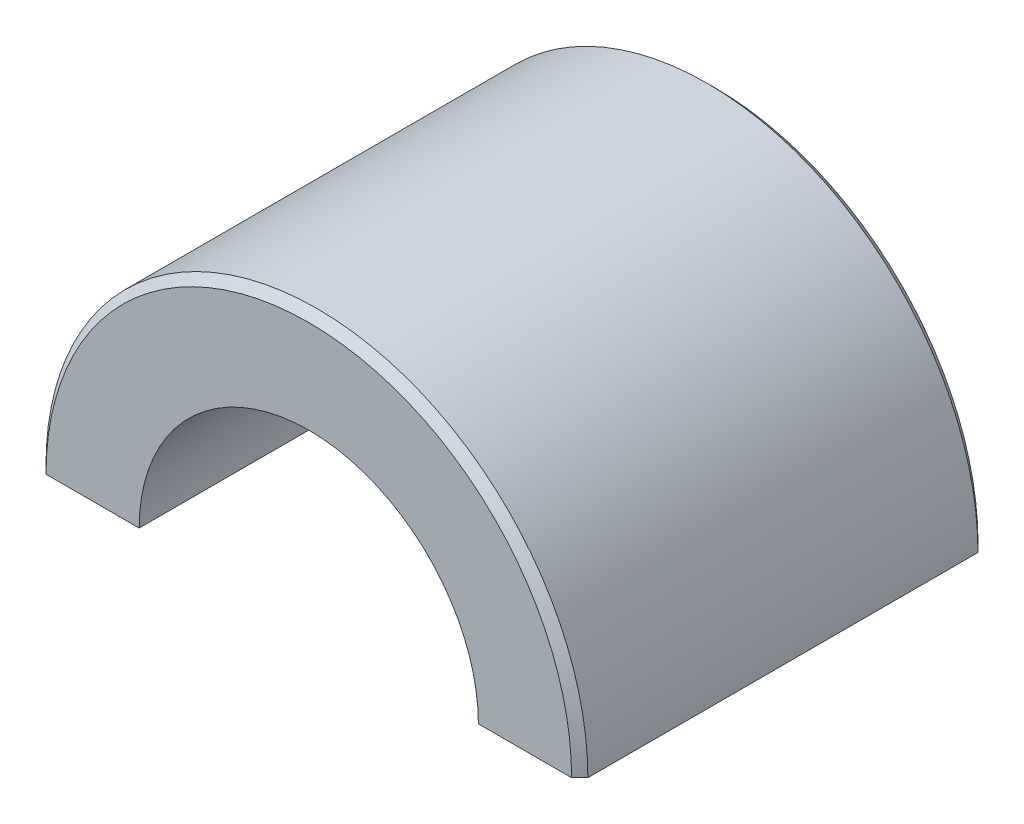
ISO-10303-21;
HEADER;
FILE_DESCRIPTION(('STEP AP214'),'2;1');
FILE_NAME('part.step','',(''),(''),'','','');
FILE_SCHEMA(('AUTOMOTIVE_DESIGN { 1 0 10303 214 1 1 1 1 }'));
ENDSEC;
DATA;
#1=APPLICATION_CONTEXT('core data for automotive mechanical design processes');
#2=APPLICATION_PROTOCOL_DEFINITION('international standard','automotive_design',2000,#1);
#3=PRODUCT_CONTEXT('',#1,'mechanical');
#4=PRODUCT('Part','Part','',(#3));
#5=PRODUCT_RELATED_PRODUCT_CATEGORY('part','',(#4));
#6=PRODUCT_DEFINITION_FORMATION('','',#4);
#7=PRODUCT_DEFINITION_CONTEXT('part definition',#1,'design');
#8=PRODUCT_DEFINITION('design','',#6,#7);
#9=PRODUCT_DEFINITION_SHAPE('','',#8);
#10=(LENGTH_UNIT() NAMED_UNIT(*) SI_UNIT(.MILLI.,.METRE.));
#11=(NAMED_UNIT(*) PLANE_ANGLE_UNIT() SI_UNIT($,.RADIAN.));
#12=(NAMED_UNIT(*) SI_UNIT($,.STERADIAN.) SOLID_ANGLE_UNIT());
#13=UNCERTAINTY_MEASURE_WITH_UNIT(LENGTH_MEASURE(1.E-05),#10,'distance_accuracy_value','');
#14=(GEOMETRIC_REPRESENTATION_CONTEXT(3) GLOBAL_UNCERTAINTY_ASSIGNED_CONTEXT((#13)) GLOBAL_UNIT_ASSIGNED_CONTEXT((#10,
#11,#12)) REPRESENTATION_CONTEXT('',''));
#15=CARTESIAN_POINT('',(0.,0.,0.));
#16=DIRECTION('',(0.,0.,1.));
#17=DIRECTION('',(1.,0.,0.));
#18=AXIS2_PLACEMENT_3D('',#15,#16,#17);
#19=CARTESIAN_POINT('',(0.,1.26634813746307E-13,19.05));
#20=DIRECTION('',(0.,0.,-1.));
#21=DIRECTION('',(-1.,0.,0.));
#22=AXIS2_PLACEMENT_3D('',#19,#20,#21);
#23=CYLINDRICAL_SURFACE('',#22,7.9502);
#24=CARTESIAN_POINT('',(0.,0.,0.));
#25=DIRECTION('',(0.,0.,-1.));
#26=DIRECTION('',(1.,0.,0.));
#27=AXIS2_PLACEMENT_3D('',#24,#25,#26);
#28=CIRCLE('',#27,7.9502);
#29=CARTESIAN_POINT('',(-7.95020000000002,1.23165366794353E-13,0.));
#30=VERTEX_POINT('',#29);
#31=CARTESIAN_POINT('',(7.95019999999999,0.,0.));
#32=VERTEX_POINT('',#31);
#33=EDGE_CURVE('E109',#30,#32,#28,.T.);
#34=ORIENTED_EDGE('',*,*,#33,.T.);
#35=DIRECTION('',(0.,0.,-1.));
#36=VECTOR('',#35,1.);
#37=CARTESIAN_POINT('',(7.9502,1.21430643318376E-13,19.05));
#38=LINE('',#37,#36);
#39=CARTESIAN_POINT('',(7.9502,1.21430643318376E-13,19.05));
#40=VERTEX_POINT('',#39);
#41=EDGE_CURVE('E93',#40,#32,#38,.T.);
#42=ORIENTED_EDGE('',*,*,#41,.F.);
#43=CARTESIAN_POINT('',(0.,1.26634813746307E-13,19.05));
#44=DIRECTION('',(0.,0.,-1.));
#45=DIRECTION('',(1.,0.,0.));
#46=AXIS2_PLACEMENT_3D('',#43,#44,#45);
#47=CIRCLE('',#46,7.9502);
#48=CARTESIAN_POINT('',(-7.95020000000003,0.,19.05));
#49=VERTEX_POINT('',#48);
#50=EDGE_CURVE('E98',#49,#40,#47,.T.);
#51=ORIENTED_EDGE('',*,*,#50,.F.);
#52=DIRECTION('',(0.,0.,-1.));
#53=VECTOR('',#52,1.);
#54=CARTESIAN_POINT('',(-7.95020000000003,0.,19.05));
#55=LINE('',#54,#53);
#56=EDGE_CURVE('E144',#49,#30,#55,.T.);
#57=ORIENTED_EDGE('',*,*,#56,.T.);
#58=EDGE_LOOP('',(#34,#42,#51,#57));
#59=FACE_BOUND('',#58,.T.);
#60=ADVANCED_FACE('F36',(#59),#23,.F.);
#61=CARTESIAN_POINT('',(7.9502,1.21430643318376E-13,19.05));
#62=DIRECTION('',(0.,1.,0.));
#63=DIRECTION('',(-1.,0.,0.));
#64=AXIS2_PLACEMENT_3D('',#61,#62,#63);
#65=PLANE('',#64);
#66=DIRECTION('',(1.,0.,0.));
#67=VECTOR('',#66,1.);
#68=CARTESIAN_POINT('',(7.95019999999999,0.,0.));
#69=LINE('',#68,#67);
#70=CARTESIAN_POINT('',(12.319,0.,0.));
#71=VERTEX_POINT('',#70);
#72=EDGE_CURVE('E128',#32,#71,#69,.T.);
#73=ORIENTED_EDGE('',*,*,#72,.T.);
#74=DIRECTION('',(-0.707106781186548,0.,-0.707106781186548));
#75=VECTOR('',#74,1.);
#76=CARTESIAN_POINT('',(0.,0.,-12.319));
#77=LINE('',#76,#75);
#78=CARTESIAN_POINT('',(12.7,0.,0.381000000000013));
#79=VERTEX_POINT('',#78);
#80=EDGE_CURVE('E44',#71,#79,#77,.F.);
#81=ORIENTED_EDGE('',*,*,#80,.T.);
#82=DIRECTION('',(0.,0.,-1.));
#83=VECTOR('',#82,1.);
#84=CARTESIAN_POINT('',(12.7,1.2490009027033E-13,19.05));
#85=LINE('',#84,#83);
#86=CARTESIAN_POINT('',(12.7,1.2490009027033E-13,18.669));
#87=VERTEX_POINT('',#86);
#88=EDGE_CURVE('E111',#87,#79,#85,.T.);
#89=ORIENTED_EDGE('',*,*,#88,.F.);
#90=DIRECTION('',(0.707106781186547,0.,-0.707106781186549));
#91=VECTOR('',#90,1.);
#92=CARTESIAN_POINT('',(0.,0.,31.3690000000001));
#93=LINE('',#92,#91);
#94=CARTESIAN_POINT('',(12.319,0.,19.05));
#95=VERTEX_POINT('',#94);
#96=EDGE_CURVE('E51',#87,#95,#93,.F.);
#97=ORIENTED_EDGE('',*,*,#96,.T.);
#98=DIRECTION('',(1.,0.,0.));
#99=VECTOR('',#98,1.);
#100=CARTESIAN_POINT('',(7.9502,1.21430643318376E-13,19.05));
#101=LINE('',#100,#99);
#102=EDGE_CURVE('E89',#40,#95,#101,.T.);
#103=ORIENTED_EDGE('',*,*,#102,.F.);
#104=ORIENTED_EDGE('',*,*,#41,.T.);
#105=EDGE_LOOP('',(#73,#81,#89,#97,#103,#104));
#106=FACE_BOUND('',#105,.T.);
#107=ADVANCED_FACE('F91',(#106),#65,.F.);
#108=CARTESIAN_POINT('',(0.,1.26634813746307E-13,19.05));
#109=DIRECTION('',(0.,0.,-1.));
#110=DIRECTION('',(-1.,0.,0.));
#111=AXIS2_PLACEMENT_3D('',#108,#109,#110);
#112=CYLINDRICAL_SURFACE('',#111,12.7);
#113=ORIENTED_EDGE('',*,*,#88,.T.);
#114=CARTESIAN_POINT('',(0.,0.,0.381000000000006));
#115=DIRECTION('',(0.,0.,1.));
#116=DIRECTION('',(1.,0.,0.));
#117=AXIS2_PLACEMENT_3D('',#114,#115,#116);
#118=CIRCLE('',#117,12.7);
#119=CARTESIAN_POINT('',(-12.7000000000001,0.,0.381000000000027));
#120=VERTEX_POINT('',#119);
#121=EDGE_CURVE('E113',#79,#120,#118,.T.);
#122=ORIENTED_EDGE('',*,*,#121,.T.);
#123=DIRECTION('',(0.,0.,-1.));
#124=VECTOR('',#123,1.);
#125=CARTESIAN_POINT('',(-12.7000000000001,0.,19.05));
#126=LINE('',#125,#124);
#127=CARTESIAN_POINT('',(-12.7000000000001,0.,18.669));
#128=VERTEX_POINT('',#127);
#129=EDGE_CURVE('E116',#128,#120,#126,.T.);
#130=ORIENTED_EDGE('',*,*,#129,.F.);
#131=CARTESIAN_POINT('',(0.,1.26634813746307E-13,18.669));
#132=DIRECTION('',(0.,0.,1.));
#133=DIRECTION('',(1.,0.,0.));
#134=AXIS2_PLACEMENT_3D('',#131,#132,#133);
#135=CIRCLE('',#134,12.7);
#136=EDGE_CURVE('E110',#128,#87,#135,.F.);
#137=ORIENTED_EDGE('',*,*,#136,.T.);
#138=EDGE_LOOP('',(#113,#122,#130,#137));
#139=FACE_BOUND('',#138,.T.);
#140=ADVANCED_FACE('F132',(#139),#112,.T.);
#141=CARTESIAN_POINT('',(-7.95020000000003,0.,19.05));
#142=DIRECTION('',(0.,1.,0.));
#143=DIRECTION('',(-1.,0.,0.));
#144=AXIS2_PLACEMENT_3D('',#141,#142,#143);
#145=PLANE('',#144);
#146=ORIENTED_EDGE('',*,*,#129,.T.);
#147=DIRECTION('',(-0.707106781186549,0.,0.707106781186548));
#148=VECTOR('',#147,1.);
#149=CARTESIAN_POINT('',(0.,0.,-12.319));
#150=LINE('',#149,#148);
#151=CARTESIAN_POINT('',(-12.319,0.,0.));
#152=VERTEX_POINT('',#151);
#153=EDGE_CURVE('E124',#120,#152,#150,.F.);
#154=ORIENTED_EDGE('',*,*,#153,.T.);
#155=DIRECTION('',(1.,0.,0.));
#156=VECTOR('',#155,1.);
#157=CARTESIAN_POINT('',(-7.95020000000002,1.23165366794353E-13,0.));
#158=LINE('',#157,#156);
#159=EDGE_CURVE('E106',#152,#30,#158,.T.);
#160=ORIENTED_EDGE('',*,*,#159,.T.);
#161=ORIENTED_EDGE('',*,*,#56,.F.);
#162=DIRECTION('',(1.,0.,0.));
#163=VECTOR('',#162,1.);
#164=CARTESIAN_POINT('',(-7.95020000000003,0.,19.05));
#165=LINE('',#164,#163);
#166=CARTESIAN_POINT('',(-12.3190000000001,0.,19.05));
#167=VERTEX_POINT('',#166);
#168=EDGE_CURVE('E97',#167,#49,#165,.T.);
#169=ORIENTED_EDGE('',*,*,#168,.F.);
#170=DIRECTION('',(0.707106781186547,0.,0.707106781186549));
#171=VECTOR('',#170,1.);
#172=CARTESIAN_POINT('',(0.,0.,31.3690000000001));
#173=LINE('',#172,#171);
#174=EDGE_CURVE('E122',#167,#128,#173,.F.);
#175=ORIENTED_EDGE('',*,*,#174,.T.);
#176=EDGE_LOOP('',(#146,#154,#160,#161,#169,#175));
#177=FACE_BOUND('',#176,.T.);
#178=ADVANCED_FACE('F138',(#177),#145,.F.);
#179=CARTESIAN_POINT('',(0.,1.26634813746307E-13,19.05));
#180=DIRECTION('',(0.,0.,1.));
#181=DIRECTION('',(1.,0.,0.));
#182=AXIS2_PLACEMENT_3D('',#179,#180,#181);
#183=PLANE('',#182);
#184=ORIENTED_EDGE('',*,*,#102,.T.);
#185=CARTESIAN_POINT('',(0.,1.26634813746307E-13,19.05));
#186=DIRECTION('',(0.,0.,1.));
#187=DIRECTION('',(1.,0.,0.));
#188=AXIS2_PLACEMENT_3D('',#185,#186,#187);
#189=CIRCLE('',#188,12.319);
#190=EDGE_CURVE('E11',#95,#167,#189,.T.);
#191=ORIENTED_EDGE('',*,*,#190,.T.);
#192=ORIENTED_EDGE('',*,*,#168,.T.);
#193=ORIENTED_EDGE('',*,*,#50,.T.);
#194=EDGE_LOOP('',(#184,#191,#192,#193));
#195=FACE_BOUND('',#194,.T.);
#196=ADVANCED_FACE('F101',(#195),#183,.T.);
#197=CARTESIAN_POINT('',(0.,0.,0.));
#198=DIRECTION('',(0.,0.,1.));
#199=DIRECTION('',(1.,0.,0.));
#200=AXIS2_PLACEMENT_3D('',#197,#198,#199);
#201=PLANE('',#200);
#202=ORIENTED_EDGE('',*,*,#159,.F.);
#203=CARTESIAN_POINT('',(0.,0.,0.));
#204=DIRECTION('',(0.,0.,1.));
#205=DIRECTION('',(1.,0.,0.));
#206=AXIS2_PLACEMENT_3D('',#203,#204,#205);
#207=CIRCLE('',#206,12.319);
#208=EDGE_CURVE('E59',#152,#71,#207,.F.);
#209=ORIENTED_EDGE('',*,*,#208,.T.);
#210=ORIENTED_EDGE('',*,*,#72,.F.);
#211=ORIENTED_EDGE('',*,*,#33,.F.);
#212=EDGE_LOOP('',(#202,#209,#210,#211));
#213=FACE_BOUND('',#212,.T.);
#214=ADVANCED_FACE('F139',(#213),#201,.F.);
#215=CARTESIAN_POINT('',(0.,0.,0.381000000000006));
#216=DIRECTION('',(0.,0.,1.));
#217=DIRECTION('',(1.,0.,0.));
#218=AXIS2_PLACEMENT_3D('',#215,#216,#217);
#219=CONICAL_SURFACE('',#218,12.7,0.785398163397448);
#220=ORIENTED_EDGE('',*,*,#80,.F.);
#221=ORIENTED_EDGE('',*,*,#208,.F.);
#222=ORIENTED_EDGE('',*,*,#153,.F.);
#223=ORIENTED_EDGE('',*,*,#121,.F.);
#224=EDGE_LOOP('',(#220,#221,#222,#223));
#225=FACE_BOUND('',#224,.T.);
#226=ADVANCED_FACE('F136',(#225),#219,.T.);
#227=CARTESIAN_POINT('',(0.,1.26634813746307E-13,19.05));
#228=DIRECTION('',(0.,0.,-1.));
#229=DIRECTION('',(-1.,0.,0.));
#230=AXIS2_PLACEMENT_3D('',#227,#228,#229);
#231=CONICAL_SURFACE('',#230,12.319,0.785398163397446);
#232=ORIENTED_EDGE('',*,*,#96,.F.);
#233=ORIENTED_EDGE('',*,*,#136,.F.);
#234=ORIENTED_EDGE('',*,*,#174,.F.);
#235=ORIENTED_EDGE('',*,*,#190,.F.);
#236=EDGE_LOOP('',(#232,#233,#234,#235));
#237=FACE_BOUND('',#236,.T.);
#238=ADVANCED_FACE('F38',(#237),#231,.T.);
#239=CLOSED_SHELL('',(#60,#107,#140,#178,#196,#214,#226,#238));
#240=MANIFOLD_SOLID_BREP('B2',#239);
#241=ADVANCED_BREP_SHAPE_REPRESENTATION('',(#18,#240),#14);
#242=SHAPE_DEFINITION_REPRESENTATION(#9,#241);
ENDSEC;
END-ISO-10303-21;
